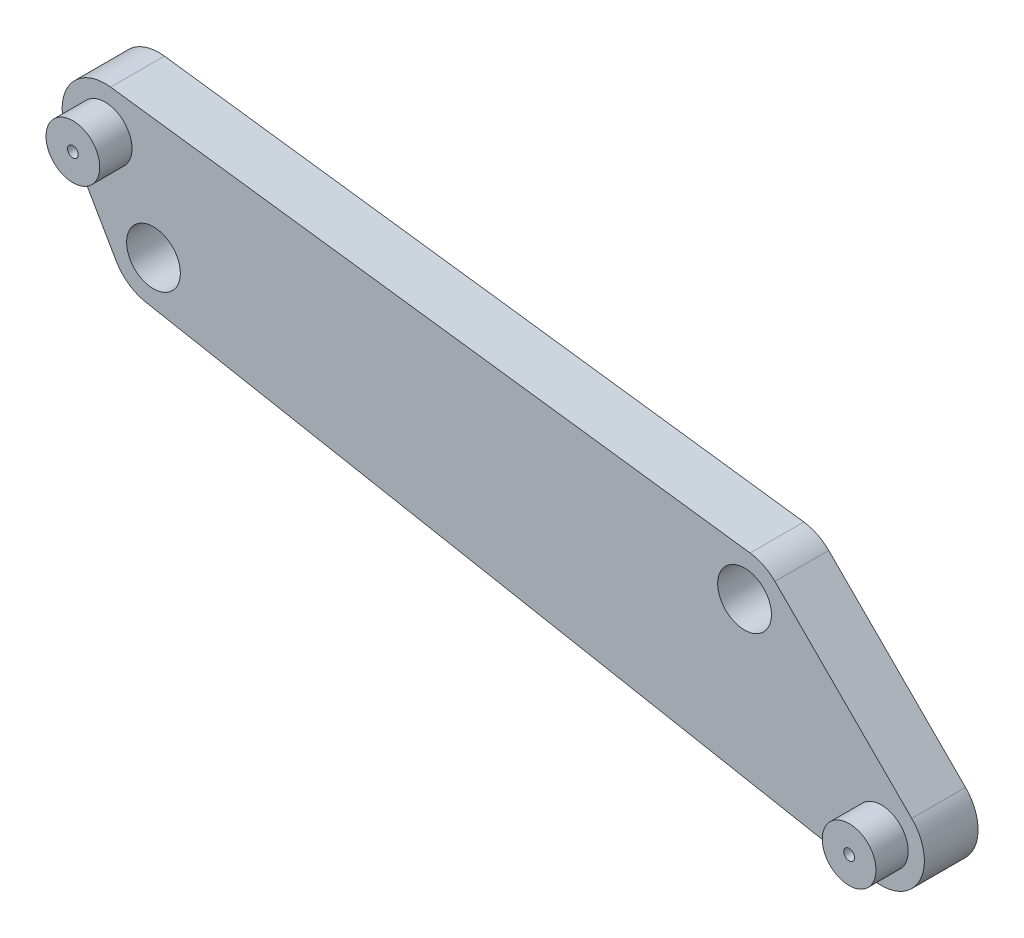
ISO-10303-21;
HEADER;
FILE_DESCRIPTION(('STEP AP214'),'2;1');
FILE_NAME('part.step','',(''),(''),'','','');
FILE_SCHEMA(('AUTOMOTIVE_DESIGN { 1 0 10303 214 1 1 1 1 }'));
ENDSEC;
DATA;
#1=APPLICATION_CONTEXT('core data for automotive mechanical design processes');
#2=APPLICATION_PROTOCOL_DEFINITION('international standard','automotive_design',2000,#1);
#3=PRODUCT_CONTEXT('',#1,'mechanical');
#4=PRODUCT('Part','Part','',(#3));
#5=PRODUCT_RELATED_PRODUCT_CATEGORY('part','',(#4));
#6=PRODUCT_DEFINITION_FORMATION('','',#4);
#7=PRODUCT_DEFINITION_CONTEXT('part definition',#1,'design');
#8=PRODUCT_DEFINITION('design','',#6,#7);
#9=PRODUCT_DEFINITION_SHAPE('','',#8);
#10=(LENGTH_UNIT() NAMED_UNIT(*) SI_UNIT(.MILLI.,.METRE.));
#11=(NAMED_UNIT(*) PLANE_ANGLE_UNIT() SI_UNIT($,.RADIAN.));
#12=(NAMED_UNIT(*) SI_UNIT($,.STERADIAN.) SOLID_ANGLE_UNIT());
#13=UNCERTAINTY_MEASURE_WITH_UNIT(LENGTH_MEASURE(1.E-05),#10,'distance_accuracy_value','');
#14=(GEOMETRIC_REPRESENTATION_CONTEXT(3) GLOBAL_UNCERTAINTY_ASSIGNED_CONTEXT((#13)) GLOBAL_UNIT_ASSIGNED_CONTEXT((#10,
#11,#12)) REPRESENTATION_CONTEXT('',''));
#15=CARTESIAN_POINT('',(0.,0.,0.));
#16=DIRECTION('',(0.,0.,1.));
#17=DIRECTION('',(1.,0.,0.));
#18=AXIS2_PLACEMENT_3D('',#15,#16,#17);
#19=CARTESIAN_POINT('',(-55.,0.,5.));
#20=DIRECTION('',(0.,0.,1.));
#21=DIRECTION('',(1.,0.,0.));
#22=AXIS2_PLACEMENT_3D('',#19,#20,#21);
#23=PLANE('',#22);
#24=CARTESIAN_POINT('',(0.,0.,5.));
#25=DIRECTION('',(0.,0.,1.));
#26=DIRECTION('',(1.,0.,0.));
#27=AXIS2_PLACEMENT_3D('',#24,#25,#26);
#28=CIRCLE('',#27,2.5);
#29=CARTESIAN_POINT('',(2.5,0.,5.));
#30=VERTEX_POINT('',#29);
#31=EDGE_CURVE('E220',#30,#30,#28,.T.);
#32=ORIENTED_EDGE('',*,*,#31,.F.);
#33=EDGE_LOOP('',(#32));
#34=FACE_BOUND('',#33,.T.);
#35=CARTESIAN_POINT('',(-55.,0.,5.));
#36=DIRECTION('',(0.,0.,1.));
#37=DIRECTION('',(1.,0.,0.));
#38=AXIS2_PLACEMENT_3D('',#35,#36,#37);
#39=CIRCLE('',#38,2.5);
#40=CARTESIAN_POINT('',(-52.5,0.,5.));
#41=VERTEX_POINT('',#40);
#42=EDGE_CURVE('E146',#41,#41,#39,.T.);
#43=ORIENTED_EDGE('',*,*,#42,.F.);
#44=EDGE_LOOP('',(#43));
#45=FACE_BOUND('',#44,.T.);
#46=CARTESIAN_POINT('',(-55.,0.,5.));
#47=DIRECTION('',(0.,0.,1.));
#48=DIRECTION('',(1.,0.,0.));
#49=AXIS2_PLACEMENT_3D('',#46,#47,#48);
#50=CIRCLE('',#49,4.00000000000001);
#51=CARTESIAN_POINT('',(-58.4641016151378,-2.,5.));
#52=VERTEX_POINT('',#51);
#53=CARTESIAN_POINT('',(-55.7387766284219,-3.93118418460618,5.));
#54=VERTEX_POINT('',#53);
#55=EDGE_CURVE('E164',#52,#54,#50,.T.);
#56=ORIENTED_EDGE('',*,*,#55,.T.);
#57=DIRECTION('',(0.98279604615154,-0.184694157105469,0.));
#58=VECTOR('',#57,1.);
#59=CARTESIAN_POINT('',(11.9891454329361,-16.6591062459639,5.));
#60=LINE('',#59,#58);
#61=CARTESIAN_POINT('',(11.9891454329361,-16.6591062459639,5.));
#62=VERTEX_POINT('',#61);
#63=EDGE_CURVE('E100',#54,#62,#60,.T.);
#64=ORIENTED_EDGE('',*,*,#63,.T.);
#65=CARTESIAN_POINT('',(12.7279220613579,-12.7279220613578,5.));
#66=DIRECTION('',(0.,0.,1.));
#67=DIRECTION('',(1.,0.,0.));
#68=AXIS2_PLACEMENT_3D('',#65,#66,#67);
#69=CIRCLE('',#68,4.);
#70=CARTESIAN_POINT('',(15.5563491861041,-9.89949493661158,5.));
#71=VERTEX_POINT('',#70);
#72=EDGE_CURVE('E185',#62,#71,#69,.T.);
#73=ORIENTED_EDGE('',*,*,#72,.T.);
#74=DIRECTION('',(-0.707106781186552,0.707106781186543,0.));
#75=VECTOR('',#74,1.);
#76=CARTESIAN_POINT('',(2.82842712474617,2.82842712474621,5.));
#77=LINE('',#76,#75);
#78=CARTESIAN_POINT('',(2.82842712474617,2.82842712474621,5.));
#79=VERTEX_POINT('',#78);
#80=EDGE_CURVE('E199',#71,#79,#77,.T.);
#81=ORIENTED_EDGE('',*,*,#80,.T.);
#82=CARTESIAN_POINT('',(0.,0.,5.));
#83=DIRECTION('',(0.,0.,1.));
#84=DIRECTION('',(1.,0.,0.));
#85=AXIS2_PLACEMENT_3D('',#82,#83,#84);
#86=CIRCLE('',#85,4.);
#87=CARTESIAN_POINT('',(0.519543088518699,3.96611585549041,5.));
#88=VERTEX_POINT('',#87);
#89=EDGE_CURVE('E119',#79,#88,#86,.T.);
#90=ORIENTED_EDGE('',*,*,#89,.T.);
#91=DIRECTION('',(-0.991528963872603,0.129885772129675,0.));
#92=VECTOR('',#91,1.);
#93=CARTESIAN_POINT('',(-58.9804569114813,11.7603444895504,5.));
#94=LINE('',#93,#92);
#95=CARTESIAN_POINT('',(-58.9804569114813,11.7603444895504,5.));
#96=VERTEX_POINT('',#95);
#97=EDGE_CURVE('E113',#88,#96,#94,.T.);
#98=ORIENTED_EDGE('',*,*,#97,.T.);
#99=CARTESIAN_POINT('',(-59.5,7.79422863405995,5.));
#100=DIRECTION('',(0.,0.,1.));
#101=DIRECTION('',(1.,0.,0.));
#102=AXIS2_PLACEMENT_3D('',#99,#100,#101);
#103=CIRCLE('',#102,4.);
#104=CARTESIAN_POINT('',(-62.9641016151377,5.79422863405996,5.));
#105=VERTEX_POINT('',#104);
#106=EDGE_CURVE('E117',#96,#105,#103,.T.);
#107=ORIENTED_EDGE('',*,*,#106,.T.);
#108=DIRECTION('',(0.499999999999997,-0.86602540378444,0.));
#109=VECTOR('',#108,1.);
#110=CARTESIAN_POINT('',(-58.4641016151378,-2.,5.));
#111=LINE('',#110,#109);
#112=EDGE_CURVE('E57',#105,#52,#111,.T.);
#113=ORIENTED_EDGE('',*,*,#112,.T.);
#114=EDGE_LOOP('',(#56,#64,#73,#81,#90,#98,#107,#113));
#115=FACE_BOUND('',#114,.T.);
#116=CARTESIAN_POINT('',(-59.5,7.79422863405995,5.));
#117=DIRECTION('',(0.,0.,1.));
#118=DIRECTION('',(1.,0.,0.));
#119=AXIS2_PLACEMENT_3D('',#116,#117,#118);
#120=CIRCLE('',#119,2.50000000000001);
#121=CARTESIAN_POINT('',(-57.,7.79422863405995,5.));
#122=VERTEX_POINT('',#121);
#123=EDGE_CURVE('E213',#122,#122,#120,.T.);
#124=ORIENTED_EDGE('',*,*,#123,.F.);
#125=EDGE_LOOP('',(#124));
#126=FACE_BOUND('',#125,.T.);
#127=CARTESIAN_POINT('',(12.7279220613579,-12.7279220613578,5.));
#128=DIRECTION('',(0.,0.,1.));
#129=DIRECTION('',(1.,0.,0.));
#130=AXIS2_PLACEMENT_3D('',#127,#128,#129);
#131=CIRCLE('',#130,2.5);
#132=CARTESIAN_POINT('',(15.2279220613579,-12.7279220613578,5.));
#133=VERTEX_POINT('',#132);
#134=EDGE_CURVE('E225',#133,#133,#131,.T.);
#135=ORIENTED_EDGE('',*,*,#134,.F.);
#136=EDGE_LOOP('',(#135));
#137=FACE_BOUND('',#136,.T.);
#138=ADVANCED_FACE('F39',(#34,#45,#115,#126,#137),#23,.T.);
#139=CARTESIAN_POINT('',(-55.,0.,0.));
#140=DIRECTION('',(0.,0.,1.));
#141=DIRECTION('',(1.,0.,0.));
#142=AXIS2_PLACEMENT_3D('',#139,#140,#141);
#143=PLANE('',#142);
#144=CARTESIAN_POINT('',(-55.,0.,0.));
#145=DIRECTION('',(0.,0.,1.));
#146=DIRECTION('',(1.,0.,0.));
#147=AXIS2_PLACEMENT_3D('',#144,#145,#146);
#148=CIRCLE('',#147,4.00000000000001);
#149=CARTESIAN_POINT('',(-58.4641016151378,-2.,0.));
#150=VERTEX_POINT('',#149);
#151=CARTESIAN_POINT('',(-55.7387766284219,-3.93118418460618,0.));
#152=VERTEX_POINT('',#151);
#153=EDGE_CURVE('E141',#150,#152,#148,.T.);
#154=ORIENTED_EDGE('',*,*,#153,.F.);
#155=DIRECTION('',(0.499999999999997,-0.86602540378444,0.));
#156=VECTOR('',#155,1.);
#157=CARTESIAN_POINT('',(-58.4641016151378,-2.,0.));
#158=LINE('',#157,#156);
#159=CARTESIAN_POINT('',(-62.9641016151377,5.79422863405996,0.));
#160=VERTEX_POINT('',#159);
#161=EDGE_CURVE('E92',#160,#150,#158,.T.);
#162=ORIENTED_EDGE('',*,*,#161,.F.);
#163=CARTESIAN_POINT('',(-59.5,7.79422863405995,0.));
#164=DIRECTION('',(0.,0.,1.));
#165=DIRECTION('',(1.,0.,0.));
#166=AXIS2_PLACEMENT_3D('',#163,#164,#165);
#167=CIRCLE('',#166,4.);
#168=CARTESIAN_POINT('',(-58.9804569114813,11.7603444895504,0.));
#169=VERTEX_POINT('',#168);
#170=EDGE_CURVE('E86',#169,#160,#167,.T.);
#171=ORIENTED_EDGE('',*,*,#170,.F.);
#172=DIRECTION('',(-0.991528963872603,0.129885772129675,0.));
#173=VECTOR('',#172,1.);
#174=CARTESIAN_POINT('',(-58.9804569114813,11.7603444895504,0.));
#175=LINE('',#174,#173);
#176=CARTESIAN_POINT('',(0.519543088518699,3.96611585549041,0.));
#177=VERTEX_POINT('',#176);
#178=EDGE_CURVE('E128',#177,#169,#175,.T.);
#179=ORIENTED_EDGE('',*,*,#178,.F.);
#180=CARTESIAN_POINT('',(0.,0.,0.));
#181=DIRECTION('',(0.,0.,1.));
#182=DIRECTION('',(1.,0.,0.));
#183=AXIS2_PLACEMENT_3D('',#180,#181,#182);
#184=CIRCLE('',#183,4.);
#185=CARTESIAN_POINT('',(2.82842712474617,2.82842712474621,0.));
#186=VERTEX_POINT('',#185);
#187=EDGE_CURVE('E155',#186,#177,#184,.T.);
#188=ORIENTED_EDGE('',*,*,#187,.F.);
#189=DIRECTION('',(-0.707106781186552,0.707106781186543,0.));
#190=VECTOR('',#189,1.);
#191=CARTESIAN_POINT('',(2.82842712474617,2.82842712474621,0.));
#192=LINE('',#191,#190);
#193=CARTESIAN_POINT('',(15.5563491861041,-9.89949493661158,0.));
#194=VERTEX_POINT('',#193);
#195=EDGE_CURVE('E152',#194,#186,#192,.T.);
#196=ORIENTED_EDGE('',*,*,#195,.F.);
#197=CARTESIAN_POINT('',(12.7279220613579,-12.7279220613578,0.));
#198=DIRECTION('',(0.,0.,1.));
#199=DIRECTION('',(1.,0.,0.));
#200=AXIS2_PLACEMENT_3D('',#197,#198,#199);
#201=CIRCLE('',#200,4.);
#202=CARTESIAN_POINT('',(11.9891454329361,-16.6591062459639,0.));
#203=VERTEX_POINT('',#202);
#204=EDGE_CURVE('E149',#203,#194,#201,.T.);
#205=ORIENTED_EDGE('',*,*,#204,.F.);
#206=DIRECTION('',(0.98279604615154,-0.184694157105469,0.));
#207=VECTOR('',#206,1.);
#208=CARTESIAN_POINT('',(11.9891454329361,-16.6591062459639,0.));
#209=LINE('',#208,#207);
#210=EDGE_CURVE('E145',#152,#203,#209,.T.);
#211=ORIENTED_EDGE('',*,*,#210,.F.);
#212=EDGE_LOOP('',(#154,#162,#171,#179,#188,#196,#205,#211));
#213=FACE_BOUND('',#212,.T.);
#214=CARTESIAN_POINT('',(-55.,0.,0.));
#215=DIRECTION('',(0.,0.,1.));
#216=DIRECTION('',(1.,0.,0.));
#217=AXIS2_PLACEMENT_3D('',#214,#215,#216);
#218=CIRCLE('',#217,2.5);
#219=CARTESIAN_POINT('',(-52.5,0.,0.));
#220=VERTEX_POINT('',#219);
#221=EDGE_CURVE('E209',#220,#220,#218,.T.);
#222=ORIENTED_EDGE('',*,*,#221,.T.);
#223=EDGE_LOOP('',(#222));
#224=FACE_BOUND('',#223,.T.);
#225=CARTESIAN_POINT('',(0.,0.,0.));
#226=DIRECTION('',(0.,0.,1.));
#227=DIRECTION('',(1.,0.,0.));
#228=AXIS2_PLACEMENT_3D('',#225,#226,#227);
#229=CIRCLE('',#228,2.5);
#230=CARTESIAN_POINT('',(2.5,0.,0.));
#231=VERTEX_POINT('',#230);
#232=EDGE_CURVE('E221',#231,#231,#229,.T.);
#233=ORIENTED_EDGE('',*,*,#232,.T.);
#234=EDGE_LOOP('',(#233));
#235=FACE_BOUND('',#234,.T.);
#236=CARTESIAN_POINT('',(-59.5,7.79422863405995,0.));
#237=DIRECTION('',(0.,0.,-1.));
#238=DIRECTION('',(-1.,0.,0.));
#239=AXIS2_PLACEMENT_3D('',#236,#237,#238);
#240=CIRCLE('',#239,0.499999999999999);
#241=CARTESIAN_POINT('',(-60.,7.79422863405995,0.));
#242=VERTEX_POINT('',#241);
#243=EDGE_CURVE('E237',#242,#242,#240,.T.);
#244=ORIENTED_EDGE('',*,*,#243,.F.);
#245=EDGE_LOOP('',(#244));
#246=FACE_BOUND('',#245,.T.);
#247=CARTESIAN_POINT('',(12.7279220613579,-12.7279220613578,0.));
#248=DIRECTION('',(0.,0.,-1.));
#249=DIRECTION('',(-1.,0.,0.));
#250=AXIS2_PLACEMENT_3D('',#247,#248,#249);
#251=CIRCLE('',#250,0.500000000000001);
#252=CARTESIAN_POINT('',(12.2279220613579,-12.7279220613578,0.));
#253=VERTEX_POINT('',#252);
#254=EDGE_CURVE('E249',#253,#253,#251,.T.);
#255=ORIENTED_EDGE('',*,*,#254,.F.);
#256=EDGE_LOOP('',(#255));
#257=FACE_BOUND('',#256,.T.);
#258=ADVANCED_FACE('F189',(#213,#224,#235,#246,#257),#143,.F.);
#259=CARTESIAN_POINT('',(-55.,0.,5.));
#260=DIRECTION('',(0.,0.,-1.));
#261=DIRECTION('',(-1.,0.,0.));
#262=AXIS2_PLACEMENT_3D('',#259,#260,#261);
#263=CYLINDRICAL_SURFACE('',#262,4.00000000000001);
#264=ORIENTED_EDGE('',*,*,#153,.T.);
#265=DIRECTION('',(0.,0.,-1.));
#266=VECTOR('',#265,1.);
#267=CARTESIAN_POINT('',(-55.7387766284219,-3.93118418460618,5.));
#268=LINE('',#267,#266);
#269=EDGE_CURVE('E11',#54,#152,#268,.T.);
#270=ORIENTED_EDGE('',*,*,#269,.F.);
#271=ORIENTED_EDGE('',*,*,#55,.F.);
#272=DIRECTION('',(0.,0.,-1.));
#273=VECTOR('',#272,1.);
#274=CARTESIAN_POINT('',(-58.4641016151378,-2.,5.));
#275=LINE('',#274,#273);
#276=EDGE_CURVE('E137',#52,#150,#275,.T.);
#277=ORIENTED_EDGE('',*,*,#276,.T.);
#278=EDGE_LOOP('',(#264,#270,#271,#277));
#279=FACE_BOUND('',#278,.T.);
#280=ADVANCED_FACE('F41',(#279),#263,.T.);
#281=CARTESIAN_POINT('',(11.9891454329361,-16.6591062459639,5.));
#282=DIRECTION('',(0.184694157105469,0.98279604615154,0.));
#283=DIRECTION('',(-0.98279604615154,0.184694157105469,0.));
#284=AXIS2_PLACEMENT_3D('',#281,#282,#283);
#285=PLANE('',#284);
#286=ORIENTED_EDGE('',*,*,#210,.T.);
#287=DIRECTION('',(0.,0.,-1.));
#288=VECTOR('',#287,1.);
#289=CARTESIAN_POINT('',(11.9891454329361,-16.6591062459639,5.));
#290=LINE('',#289,#288);
#291=EDGE_CURVE('E49',#62,#203,#290,.T.);
#292=ORIENTED_EDGE('',*,*,#291,.F.);
#293=ORIENTED_EDGE('',*,*,#63,.F.);
#294=ORIENTED_EDGE('',*,*,#269,.T.);
#295=EDGE_LOOP('',(#286,#292,#293,#294));
#296=FACE_BOUND('',#295,.T.);
#297=ADVANCED_FACE('F272',(#296),#285,.F.);
#298=CARTESIAN_POINT('',(12.7279220613579,-12.7279220613578,5.));
#299=DIRECTION('',(0.,0.,-1.));
#300=DIRECTION('',(-1.,0.,0.));
#301=AXIS2_PLACEMENT_3D('',#298,#299,#300);
#302=CYLINDRICAL_SURFACE('',#301,4.);
#303=ORIENTED_EDGE('',*,*,#204,.T.);
#304=DIRECTION('',(0.,0.,-1.));
#305=VECTOR('',#304,1.);
#306=CARTESIAN_POINT('',(15.5563491861041,-9.89949493661158,5.));
#307=LINE('',#306,#305);
#308=EDGE_CURVE('E175',#71,#194,#307,.T.);
#309=ORIENTED_EDGE('',*,*,#308,.F.);
#310=ORIENTED_EDGE('',*,*,#72,.F.);
#311=ORIENTED_EDGE('',*,*,#291,.T.);
#312=EDGE_LOOP('',(#303,#309,#310,#311));
#313=FACE_BOUND('',#312,.T.);
#314=ADVANCED_FACE('F183',(#313),#302,.T.);
#315=CARTESIAN_POINT('',(2.82842712474617,2.82842712474621,5.));
#316=DIRECTION('',(-0.707106781186543,-0.707106781186552,0.));
#317=DIRECTION('',(0.707106781186552,-0.707106781186543,0.));
#318=AXIS2_PLACEMENT_3D('',#315,#316,#317);
#319=PLANE('',#318);
#320=ORIENTED_EDGE('',*,*,#195,.T.);
#321=DIRECTION('',(0.,0.,-1.));
#322=VECTOR('',#321,1.);
#323=CARTESIAN_POINT('',(2.82842712474617,2.82842712474621,5.));
#324=LINE('',#323,#322);
#325=EDGE_CURVE('E171',#79,#186,#324,.T.);
#326=ORIENTED_EDGE('',*,*,#325,.F.);
#327=ORIENTED_EDGE('',*,*,#80,.F.);
#328=ORIENTED_EDGE('',*,*,#308,.T.);
#329=EDGE_LOOP('',(#320,#326,#327,#328));
#330=FACE_BOUND('',#329,.T.);
#331=ADVANCED_FACE('F194',(#330),#319,.F.);
#332=CARTESIAN_POINT('',(0.,0.,5.));
#333=DIRECTION('',(0.,0.,-1.));
#334=DIRECTION('',(-1.,0.,0.));
#335=AXIS2_PLACEMENT_3D('',#332,#333,#334);
#336=CYLINDRICAL_SURFACE('',#335,4.);
#337=ORIENTED_EDGE('',*,*,#187,.T.);
#338=DIRECTION('',(0.,0.,-1.));
#339=VECTOR('',#338,1.);
#340=CARTESIAN_POINT('',(0.519543088518699,3.96611585549041,5.));
#341=LINE('',#340,#339);
#342=EDGE_CURVE('E130',#88,#177,#341,.T.);
#343=ORIENTED_EDGE('',*,*,#342,.F.);
#344=ORIENTED_EDGE('',*,*,#89,.F.);
#345=ORIENTED_EDGE('',*,*,#325,.T.);
#346=EDGE_LOOP('',(#337,#343,#344,#345));
#347=FACE_BOUND('',#346,.T.);
#348=ADVANCED_FACE('F197',(#347),#336,.T.);
#349=CARTESIAN_POINT('',(-58.9804569114813,11.7603444895504,5.));
#350=DIRECTION('',(-0.129885772129675,-0.991528963872603,0.));
#351=DIRECTION('',(0.991528963872603,-0.129885772129675,0.));
#352=AXIS2_PLACEMENT_3D('',#349,#350,#351);
#353=PLANE('',#352);
#354=ORIENTED_EDGE('',*,*,#178,.T.);
#355=DIRECTION('',(0.,0.,-1.));
#356=VECTOR('',#355,1.);
#357=CARTESIAN_POINT('',(-58.9804569114813,11.7603444895504,5.));
#358=LINE('',#357,#356);
#359=EDGE_CURVE('E125',#96,#169,#358,.T.);
#360=ORIENTED_EDGE('',*,*,#359,.F.);
#361=ORIENTED_EDGE('',*,*,#97,.F.);
#362=ORIENTED_EDGE('',*,*,#342,.T.);
#363=EDGE_LOOP('',(#354,#360,#361,#362));
#364=FACE_BOUND('',#363,.T.);
#365=ADVANCED_FACE('F126',(#364),#353,.F.);
#366=CARTESIAN_POINT('',(-59.5,7.79422863405995,5.));
#367=DIRECTION('',(0.,0.,-1.));
#368=DIRECTION('',(-1.,0.,0.));
#369=AXIS2_PLACEMENT_3D('',#366,#367,#368);
#370=CYLINDRICAL_SURFACE('',#369,4.);
#371=ORIENTED_EDGE('',*,*,#170,.T.);
#372=DIRECTION('',(0.,0.,-1.));
#373=VECTOR('',#372,1.);
#374=CARTESIAN_POINT('',(-62.9641016151377,5.79422863405996,5.));
#375=LINE('',#374,#373);
#376=EDGE_CURVE('E131',#105,#160,#375,.T.);
#377=ORIENTED_EDGE('',*,*,#376,.F.);
#378=ORIENTED_EDGE('',*,*,#106,.F.);
#379=ORIENTED_EDGE('',*,*,#359,.T.);
#380=EDGE_LOOP('',(#371,#377,#378,#379));
#381=FACE_BOUND('',#380,.T.);
#382=ADVANCED_FACE('F133',(#381),#370,.T.);
#383=CARTESIAN_POINT('',(-58.4641016151378,-2.,5.));
#384=DIRECTION('',(0.86602540378444,0.499999999999997,0.));
#385=DIRECTION('',(-0.499999999999997,0.86602540378444,0.));
#386=AXIS2_PLACEMENT_3D('',#383,#384,#385);
#387=PLANE('',#386);
#388=ORIENTED_EDGE('',*,*,#161,.T.);
#389=ORIENTED_EDGE('',*,*,#276,.F.);
#390=ORIENTED_EDGE('',*,*,#112,.F.);
#391=ORIENTED_EDGE('',*,*,#376,.T.);
#392=EDGE_LOOP('',(#388,#389,#390,#391));
#393=FACE_BOUND('',#392,.T.);
#394=ADVANCED_FACE('F278',(#393),#387,.F.);
#395=CARTESIAN_POINT('',(-55.,0.,5.));
#396=DIRECTION('',(0.,0.,-1.));
#397=DIRECTION('',(-1.,0.,0.));
#398=AXIS2_PLACEMENT_3D('',#395,#396,#397);
#399=CYLINDRICAL_SURFACE('',#398,2.5);
#400=ORIENTED_EDGE('',*,*,#42,.T.);
#401=EDGE_LOOP('',(#400));
#402=FACE_BOUND('',#401,.T.);
#403=ORIENTED_EDGE('',*,*,#221,.F.);
#404=EDGE_LOOP('',(#403));
#405=FACE_BOUND('',#404,.T.);
#406=ADVANCED_FACE('F281',(#402,#405),#399,.F.);
#407=CARTESIAN_POINT('',(0.,0.,5.));
#408=DIRECTION('',(0.,0.,-1.));
#409=DIRECTION('',(-1.,0.,0.));
#410=AXIS2_PLACEMENT_3D('',#407,#408,#409);
#411=CYLINDRICAL_SURFACE('',#410,2.5);
#412=ORIENTED_EDGE('',*,*,#31,.T.);
#413=EDGE_LOOP('',(#412));
#414=FACE_BOUND('',#413,.T.);
#415=ORIENTED_EDGE('',*,*,#232,.F.);
#416=EDGE_LOOP('',(#415));
#417=FACE_BOUND('',#416,.T.);
#418=ADVANCED_FACE('F328',(#414,#417),#411,.F.);
#419=CARTESIAN_POINT('',(-59.5,7.79422863405995,8.));
#420=DIRECTION('',(0.,0.,-1.));
#421=DIRECTION('',(-1.,0.,0.));
#422=AXIS2_PLACEMENT_3D('',#419,#420,#421);
#423=CYLINDRICAL_SURFACE('',#422,2.50000000000002);
#424=ORIENTED_EDGE('',*,*,#123,.T.);
#425=EDGE_LOOP('',(#424));
#426=FACE_BOUND('',#425,.T.);
#427=CARTESIAN_POINT('',(-59.5,7.79422863405995,8.));
#428=DIRECTION('',(0.,0.,-1.));
#429=DIRECTION('',(-1.,0.,0.));
#430=AXIS2_PLACEMENT_3D('',#427,#428,#429);
#431=CIRCLE('',#430,2.50000000000002);
#432=CARTESIAN_POINT('',(-62.,7.79422863405995,8.));
#433=VERTEX_POINT('',#432);
#434=EDGE_CURVE('E232',#433,#433,#431,.T.);
#435=ORIENTED_EDGE('',*,*,#434,.T.);
#436=EDGE_LOOP('',(#435));
#437=FACE_BOUND('',#436,.T.);
#438=ADVANCED_FACE('F335',(#426,#437),#423,.T.);
#439=CARTESIAN_POINT('',(-59.5,7.79422863405995,8.));
#440=DIRECTION('',(0.,0.,-1.));
#441=DIRECTION('',(-1.,0.,0.));
#442=AXIS2_PLACEMENT_3D('',#439,#440,#441);
#443=PLANE('',#442);
#444=CARTESIAN_POINT('',(-59.5,7.79422863405995,8.));
#445=DIRECTION('',(0.,0.,-1.));
#446=DIRECTION('',(-1.,0.,0.));
#447=AXIS2_PLACEMENT_3D('',#444,#445,#446);
#448=CIRCLE('',#447,0.499999999999999);
#449=CARTESIAN_POINT('',(-60.,7.79422863405995,8.));
#450=VERTEX_POINT('',#449);
#451=EDGE_CURVE('E236',#450,#450,#448,.T.);
#452=ORIENTED_EDGE('',*,*,#451,.T.);
#453=EDGE_LOOP('',(#452));
#454=FACE_BOUND('',#453,.T.);
#455=ORIENTED_EDGE('',*,*,#434,.F.);
#456=EDGE_LOOP('',(#455));
#457=FACE_BOUND('',#456,.T.);
#458=ADVANCED_FACE('F343',(#454,#457),#443,.F.);
#459=CARTESIAN_POINT('',(-59.5,7.79422863405995,8.));
#460=DIRECTION('',(0.,0.,-1.));
#461=DIRECTION('',(-1.,0.,0.));
#462=AXIS2_PLACEMENT_3D('',#459,#460,#461);
#463=CYLINDRICAL_SURFACE('',#462,0.499999999999999);
#464=ORIENTED_EDGE('',*,*,#451,.F.);
#465=EDGE_LOOP('',(#464));
#466=FACE_BOUND('',#465,.T.);
#467=ORIENTED_EDGE('',*,*,#243,.T.);
#468=EDGE_LOOP('',(#467));
#469=FACE_BOUND('',#468,.T.);
#470=ADVANCED_FACE('F351',(#466,#469),#463,.F.);
#471=CARTESIAN_POINT('',(12.7279220613579,-12.7279220613578,8.));
#472=DIRECTION('',(0.,0.,-1.));
#473=DIRECTION('',(-1.,0.,0.));
#474=AXIS2_PLACEMENT_3D('',#471,#472,#473);
#475=CYLINDRICAL_SURFACE('',#474,2.5);
#476=ORIENTED_EDGE('',*,*,#134,.T.);
#477=EDGE_LOOP('',(#476));
#478=FACE_BOUND('',#477,.T.);
#479=CARTESIAN_POINT('',(12.7279220613579,-12.7279220613578,8.));
#480=DIRECTION('',(0.,0.,-1.));
#481=DIRECTION('',(-1.,0.,0.));
#482=AXIS2_PLACEMENT_3D('',#479,#480,#481);
#483=CIRCLE('',#482,2.5);
#484=CARTESIAN_POINT('',(10.2279220613579,-12.7279220613578,8.));
#485=VERTEX_POINT('',#484);
#486=EDGE_CURVE('E241',#485,#485,#483,.T.);
#487=ORIENTED_EDGE('',*,*,#486,.T.);
#488=EDGE_LOOP('',(#487));
#489=FACE_BOUND('',#488,.T.);
#490=ADVANCED_FACE('F359',(#478,#489),#475,.T.);
#491=CARTESIAN_POINT('',(12.7279220613579,-12.7279220613578,8.));
#492=DIRECTION('',(0.,0.,-1.));
#493=DIRECTION('',(-1.,0.,0.));
#494=AXIS2_PLACEMENT_3D('',#491,#492,#493);
#495=PLANE('',#494);
#496=CARTESIAN_POINT('',(12.7279220613579,-12.7279220613578,8.));
#497=DIRECTION('',(0.,0.,-1.));
#498=DIRECTION('',(-1.,0.,0.));
#499=AXIS2_PLACEMENT_3D('',#496,#497,#498);
#500=CIRCLE('',#499,0.500000000000001);
#501=CARTESIAN_POINT('',(12.2279220613579,-12.7279220613578,8.));
#502=VERTEX_POINT('',#501);
#503=EDGE_CURVE('E248',#502,#502,#500,.T.);
#504=ORIENTED_EDGE('',*,*,#503,.T.);
#505=EDGE_LOOP('',(#504));
#506=FACE_BOUND('',#505,.T.);
#507=ORIENTED_EDGE('',*,*,#486,.F.);
#508=EDGE_LOOP('',(#507));
#509=FACE_BOUND('',#508,.T.);
#510=ADVANCED_FACE('F257',(#506,#509),#495,.F.);
#511=CARTESIAN_POINT('',(12.7279220613579,-12.7279220613578,8.));
#512=DIRECTION('',(0.,0.,-1.));
#513=DIRECTION('',(-1.,0.,0.));
#514=AXIS2_PLACEMENT_3D('',#511,#512,#513);
#515=CYLINDRICAL_SURFACE('',#514,0.500000000000001);
#516=ORIENTED_EDGE('',*,*,#503,.F.);
#517=EDGE_LOOP('',(#516));
#518=FACE_BOUND('',#517,.T.);
#519=ORIENTED_EDGE('',*,*,#254,.T.);
#520=EDGE_LOOP('',(#519));
#521=FACE_BOUND('',#520,.T.);
#522=ADVANCED_FACE('F260',(#518,#521),#515,.F.);
#523=CLOSED_SHELL('',(#138,#258,#280,#297,#314,#331,#348,#365,#382,#394,#406,#418,#438,#458,
#470,#490,#510,#522));
#524=MANIFOLD_SOLID_BREP('B2',#523);
#525=ADVANCED_BREP_SHAPE_REPRESENTATION('',(#18,#524),#14);
#526=SHAPE_DEFINITION_REPRESENTATION(#9,#525);
ENDSEC;
END-ISO-10303-21;
